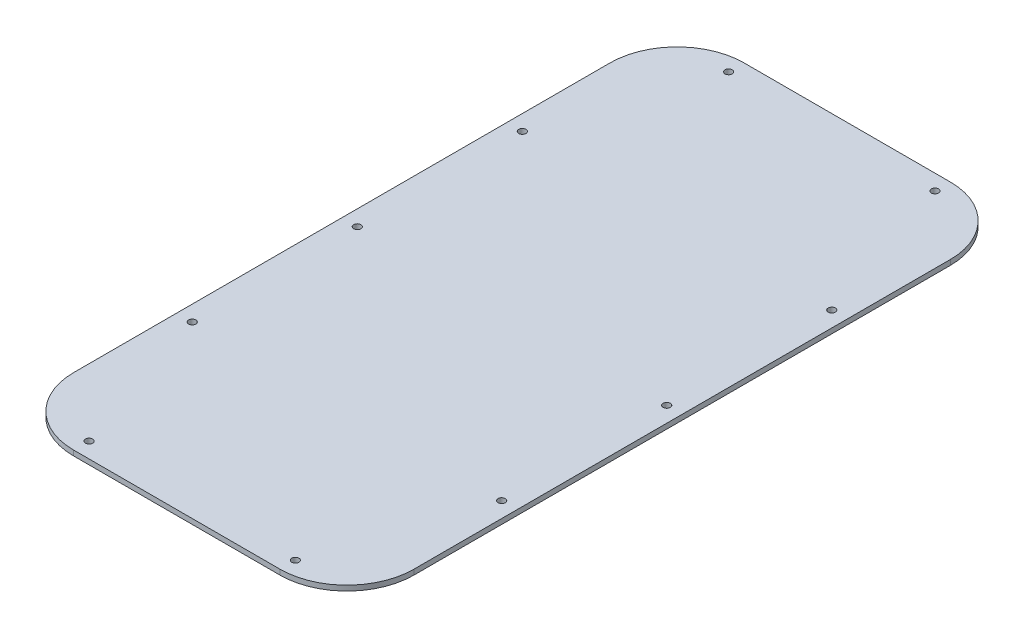
ISO-10303-21;
HEADER;
FILE_DESCRIPTION(('STEP AP214'),'2;1');
FILE_NAME('part.step','',(''),(''),'','','');
FILE_SCHEMA(('AUTOMOTIVE_DESIGN { 1 0 10303 214 1 1 1 1 }'));
ENDSEC;
DATA;
#1=APPLICATION_CONTEXT('core data for automotive mechanical design processes');
#2=APPLICATION_PROTOCOL_DEFINITION('international standard','automotive_design',2000,#1);
#3=PRODUCT_CONTEXT('',#1,'mechanical');
#4=PRODUCT('Part','Part','',(#3));
#5=PRODUCT_RELATED_PRODUCT_CATEGORY('part','',(#4));
#6=PRODUCT_DEFINITION_FORMATION('','',#4);
#7=PRODUCT_DEFINITION_CONTEXT('part definition',#1,'design');
#8=PRODUCT_DEFINITION('design','',#6,#7);
#9=PRODUCT_DEFINITION_SHAPE('','',#8);
#10=(LENGTH_UNIT() NAMED_UNIT(*) SI_UNIT(.MILLI.,.METRE.));
#11=(NAMED_UNIT(*) PLANE_ANGLE_UNIT() SI_UNIT($,.RADIAN.));
#12=(NAMED_UNIT(*) SI_UNIT($,.STERADIAN.) SOLID_ANGLE_UNIT());
#13=UNCERTAINTY_MEASURE_WITH_UNIT(LENGTH_MEASURE(1.E-05),#10,'distance_accuracy_value','');
#14=(GEOMETRIC_REPRESENTATION_CONTEXT(3) GLOBAL_UNCERTAINTY_ASSIGNED_CONTEXT((#13)) GLOBAL_UNIT_ASSIGNED_CONTEXT((#10,
#11,#12)) REPRESENTATION_CONTEXT('',''));
#15=CARTESIAN_POINT('',(0.,0.,0.));
#16=DIRECTION('',(0.,0.,1.));
#17=DIRECTION('',(1.,0.,0.));
#18=AXIS2_PLACEMENT_3D('',#15,#16,#17);
#19=CARTESIAN_POINT('',(-100.,-493.5,1585.));
#20=DIRECTION('',(0.,-1.,0.));
#21=DIRECTION('',(0.,0.,-1.));
#22=AXIS2_PLACEMENT_3D('',#19,#20,#21);
#23=CYLINDRICAL_SURFACE('',#22,65.);
#24=CARTESIAN_POINT('',(-100.,-498.5,1585.));
#25=DIRECTION('',(0.,1.,0.));
#26=DIRECTION('',(0.,0.,1.));
#27=AXIS2_PLACEMENT_3D('',#24,#25,#26);
#28=CIRCLE('',#27,65.);
#29=CARTESIAN_POINT('',(-165.,-498.5,1585.));
#30=VERTEX_POINT('',#29);
#31=CARTESIAN_POINT('',(-99.9999999999997,-498.5,1650.));
#32=VERTEX_POINT('',#31);
#33=EDGE_CURVE('E111',#30,#32,#28,.T.);
#34=ORIENTED_EDGE('',*,*,#33,.T.);
#35=DIRECTION('',(0.,-1.,0.));
#36=VECTOR('',#35,1.);
#37=CARTESIAN_POINT('',(-99.9999999999997,-493.5,1650.));
#38=LINE('',#37,#36);
#39=CARTESIAN_POINT('',(-99.9999999999997,-493.5,1650.));
#40=VERTEX_POINT('',#39);
#41=EDGE_CURVE('E10',#40,#32,#38,.T.);
#42=ORIENTED_EDGE('',*,*,#41,.F.);
#43=CARTESIAN_POINT('',(-100.,-493.5,1585.));
#44=DIRECTION('',(0.,1.,0.));
#45=DIRECTION('',(0.,0.,1.));
#46=AXIS2_PLACEMENT_3D('',#43,#44,#45);
#47=CIRCLE('',#46,65.);
#48=CARTESIAN_POINT('',(-165.,-493.5,1585.));
#49=VERTEX_POINT('',#48);
#50=EDGE_CURVE('E126',#49,#40,#47,.T.);
#51=ORIENTED_EDGE('',*,*,#50,.F.);
#52=DIRECTION('',(0.,-1.,0.));
#53=VECTOR('',#52,1.);
#54=CARTESIAN_POINT('',(-165.,-493.5,1585.));
#55=LINE('',#54,#53);
#56=EDGE_CURVE('E107',#49,#30,#55,.T.);
#57=ORIENTED_EDGE('',*,*,#56,.T.);
#58=EDGE_LOOP('',(#34,#42,#51,#57));
#59=FACE_BOUND('',#58,.T.);
#60=ADVANCED_FACE('F15',(#59),#23,.T.);
#61=CARTESIAN_POINT('',(-99.9999999999997,-493.5,1650.));
#62=DIRECTION('',(0.,0.,-1.));
#63=DIRECTION('',(-1.,0.,0.));
#64=AXIS2_PLACEMENT_3D('',#61,#62,#63);
#65=PLANE('',#64);
#66=DIRECTION('',(1.,0.,0.));
#67=VECTOR('',#66,1.);
#68=CARTESIAN_POINT('',(-99.9999999999997,-498.5,1650.));
#69=LINE('',#68,#67);
#70=CARTESIAN_POINT('',(99.9999999999998,-498.5,1650.));
#71=VERTEX_POINT('',#70);
#72=EDGE_CURVE('E114',#32,#71,#69,.T.);
#73=ORIENTED_EDGE('',*,*,#72,.T.);
#74=DIRECTION('',(0.,-1.,0.));
#75=VECTOR('',#74,1.);
#76=CARTESIAN_POINT('',(99.9999999999998,-493.5,1650.));
#77=LINE('',#76,#75);
#78=CARTESIAN_POINT('',(99.9999999999998,-493.5,1650.));
#79=VERTEX_POINT('',#78);
#80=EDGE_CURVE('E23',#79,#71,#77,.T.);
#81=ORIENTED_EDGE('',*,*,#80,.F.);
#82=DIRECTION('',(1.,0.,0.));
#83=VECTOR('',#82,1.);
#84=CARTESIAN_POINT('',(-99.9999999999997,-493.5,1650.));
#85=LINE('',#84,#83);
#86=EDGE_CURVE('E74',#40,#79,#85,.T.);
#87=ORIENTED_EDGE('',*,*,#86,.F.);
#88=ORIENTED_EDGE('',*,*,#41,.T.);
#89=EDGE_LOOP('',(#73,#81,#87,#88));
#90=FACE_BOUND('',#89,.T.);
#91=ADVANCED_FACE('F256',(#90),#65,.F.);
#92=CARTESIAN_POINT('',(100.,-493.5,1585.));
#93=DIRECTION('',(0.,-1.,0.));
#94=DIRECTION('',(0.,0.,-1.));
#95=AXIS2_PLACEMENT_3D('',#92,#93,#94);
#96=CYLINDRICAL_SURFACE('',#95,65.);
#97=CARTESIAN_POINT('',(100.,-498.5,1585.));
#98=DIRECTION('',(0.,1.,0.));
#99=DIRECTION('',(0.,0.,1.));
#100=AXIS2_PLACEMENT_3D('',#97,#98,#99);
#101=CIRCLE('',#100,65.);
#102=CARTESIAN_POINT('',(165.,-498.5,1585.));
#103=VERTEX_POINT('',#102);
#104=EDGE_CURVE('E117',#71,#103,#101,.T.);
#105=ORIENTED_EDGE('',*,*,#104,.T.);
#106=DIRECTION('',(0.,-1.,0.));
#107=VECTOR('',#106,1.);
#108=CARTESIAN_POINT('',(165.,-493.5,1585.));
#109=LINE('',#108,#107);
#110=CARTESIAN_POINT('',(165.,-493.5,1585.));
#111=VERTEX_POINT('',#110);
#112=EDGE_CURVE('E133',#111,#103,#109,.T.);
#113=ORIENTED_EDGE('',*,*,#112,.F.);
#114=CARTESIAN_POINT('',(100.,-493.5,1585.));
#115=DIRECTION('',(0.,1.,0.));
#116=DIRECTION('',(0.,0.,1.));
#117=AXIS2_PLACEMENT_3D('',#114,#115,#116);
#118=CIRCLE('',#117,65.);
#119=EDGE_CURVE('E141',#79,#111,#118,.T.);
#120=ORIENTED_EDGE('',*,*,#119,.F.);
#121=ORIENTED_EDGE('',*,*,#80,.T.);
#122=EDGE_LOOP('',(#105,#113,#120,#121));
#123=FACE_BOUND('',#122,.T.);
#124=ADVANCED_FACE('F139',(#123),#96,.T.);
#125=CARTESIAN_POINT('',(165.,-493.5,1585.));
#126=DIRECTION('',(-1.,0.,0.));
#127=DIRECTION('',(0.,0.,1.));
#128=AXIS2_PLACEMENT_3D('',#125,#126,#127);
#129=PLANE('',#128);
#130=DIRECTION('',(0.,0.,-1.));
#131=VECTOR('',#130,1.);
#132=CARTESIAN_POINT('',(165.,-498.5,1585.));
#133=LINE('',#132,#131);
#134=CARTESIAN_POINT('',(165.,-498.5,1065.));
#135=VERTEX_POINT('',#134);
#136=EDGE_CURVE('E119',#103,#135,#133,.T.);
#137=ORIENTED_EDGE('',*,*,#136,.T.);
#138=DIRECTION('',(0.,-1.,0.));
#139=VECTOR('',#138,1.);
#140=CARTESIAN_POINT('',(165.,-493.5,1065.));
#141=LINE('',#140,#139);
#142=CARTESIAN_POINT('',(165.,-493.5,1065.));
#143=VERTEX_POINT('',#142);
#144=EDGE_CURVE('E130',#143,#135,#141,.T.);
#145=ORIENTED_EDGE('',*,*,#144,.F.);
#146=DIRECTION('',(0.,0.,-1.));
#147=VECTOR('',#146,1.);
#148=CARTESIAN_POINT('',(165.,-493.5,1585.));
#149=LINE('',#148,#147);
#150=EDGE_CURVE('E153',#111,#143,#149,.T.);
#151=ORIENTED_EDGE('',*,*,#150,.F.);
#152=ORIENTED_EDGE('',*,*,#112,.T.);
#153=EDGE_LOOP('',(#137,#145,#151,#152));
#154=FACE_BOUND('',#153,.T.);
#155=ADVANCED_FACE('F149',(#154),#129,.F.);
#156=CARTESIAN_POINT('',(100.,-493.5,1065.));
#157=DIRECTION('',(0.,-1.,0.));
#158=DIRECTION('',(0.,0.,-1.));
#159=AXIS2_PLACEMENT_3D('',#156,#157,#158);
#160=CYLINDRICAL_SURFACE('',#159,65.);
#161=CARTESIAN_POINT('',(100.,-498.5,1065.));
#162=DIRECTION('',(0.,1.,0.));
#163=DIRECTION('',(0.,0.,1.));
#164=AXIS2_PLACEMENT_3D('',#161,#162,#163);
#165=CIRCLE('',#164,65.);
#166=CARTESIAN_POINT('',(99.9999999999996,-498.5,1000.));
#167=VERTEX_POINT('',#166);
#168=EDGE_CURVE('E121',#135,#167,#165,.T.);
#169=ORIENTED_EDGE('',*,*,#168,.T.);
#170=DIRECTION('',(0.,-1.,0.));
#171=VECTOR('',#170,1.);
#172=CARTESIAN_POINT('',(99.9999999999996,-493.5,1000.));
#173=LINE('',#172,#171);
#174=CARTESIAN_POINT('',(99.9999999999996,-493.5,1000.));
#175=VERTEX_POINT('',#174);
#176=EDGE_CURVE('E102',#175,#167,#173,.T.);
#177=ORIENTED_EDGE('',*,*,#176,.F.);
#178=CARTESIAN_POINT('',(100.,-493.5,1065.));
#179=DIRECTION('',(0.,1.,0.));
#180=DIRECTION('',(0.,0.,1.));
#181=AXIS2_PLACEMENT_3D('',#178,#179,#180);
#182=CIRCLE('',#181,65.);
#183=EDGE_CURVE('E93',#143,#175,#182,.T.);
#184=ORIENTED_EDGE('',*,*,#183,.F.);
#185=ORIENTED_EDGE('',*,*,#144,.T.);
#186=EDGE_LOOP('',(#169,#177,#184,#185));
#187=FACE_BOUND('',#186,.T.);
#188=ADVANCED_FACE('F152',(#187),#160,.T.);
#189=CARTESIAN_POINT('',(99.9999999999996,-493.5,1000.));
#190=DIRECTION('',(0.,0.,1.));
#191=DIRECTION('',(1.,0.,0.));
#192=AXIS2_PLACEMENT_3D('',#189,#190,#191);
#193=PLANE('',#192);
#194=DIRECTION('',(-1.,0.,0.));
#195=VECTOR('',#194,1.);
#196=CARTESIAN_POINT('',(99.9999999999996,-498.5,1000.));
#197=LINE('',#196,#195);
#198=CARTESIAN_POINT('',(-99.9999999999999,-498.5,1000.));
#199=VERTEX_POINT('',#198);
#200=EDGE_CURVE('E101',#167,#199,#197,.T.);
#201=ORIENTED_EDGE('',*,*,#200,.T.);
#202=DIRECTION('',(0.,-1.,0.));
#203=VECTOR('',#202,1.);
#204=CARTESIAN_POINT('',(-99.9999999999999,-493.5,1000.));
#205=LINE('',#204,#203);
#206=CARTESIAN_POINT('',(-99.9999999999999,-493.5,1000.));
#207=VERTEX_POINT('',#206);
#208=EDGE_CURVE('E98',#207,#199,#205,.T.);
#209=ORIENTED_EDGE('',*,*,#208,.F.);
#210=DIRECTION('',(-1.,0.,0.));
#211=VECTOR('',#210,1.);
#212=CARTESIAN_POINT('',(99.9999999999996,-493.5,1000.));
#213=LINE('',#212,#211);
#214=EDGE_CURVE('E87',#175,#207,#213,.T.);
#215=ORIENTED_EDGE('',*,*,#214,.F.);
#216=ORIENTED_EDGE('',*,*,#176,.T.);
#217=EDGE_LOOP('',(#201,#209,#215,#216));
#218=FACE_BOUND('',#217,.T.);
#219=ADVANCED_FACE('F99',(#218),#193,.F.);
#220=CARTESIAN_POINT('',(-100.,-493.5,1065.));
#221=DIRECTION('',(0.,-1.,0.));
#222=DIRECTION('',(0.,0.,-1.));
#223=AXIS2_PLACEMENT_3D('',#220,#221,#222);
#224=CYLINDRICAL_SURFACE('',#223,65.);
#225=CARTESIAN_POINT('',(-100.,-498.5,1065.));
#226=DIRECTION('',(0.,1.,0.));
#227=DIRECTION('',(0.,0.,1.));
#228=AXIS2_PLACEMENT_3D('',#225,#226,#227);
#229=CIRCLE('',#228,65.);
#230=CARTESIAN_POINT('',(-165.,-498.5,1065.));
#231=VERTEX_POINT('',#230);
#232=EDGE_CURVE('E60',#199,#231,#229,.T.);
#233=ORIENTED_EDGE('',*,*,#232,.T.);
#234=DIRECTION('',(0.,-1.,0.));
#235=VECTOR('',#234,1.);
#236=CARTESIAN_POINT('',(-165.,-493.5,1065.));
#237=LINE('',#236,#235);
#238=CARTESIAN_POINT('',(-165.,-493.5,1065.));
#239=VERTEX_POINT('',#238);
#240=EDGE_CURVE('E103',#239,#231,#237,.T.);
#241=ORIENTED_EDGE('',*,*,#240,.F.);
#242=CARTESIAN_POINT('',(-100.,-493.5,1065.));
#243=DIRECTION('',(0.,1.,0.));
#244=DIRECTION('',(0.,0.,1.));
#245=AXIS2_PLACEMENT_3D('',#242,#243,#244);
#246=CIRCLE('',#245,65.);
#247=EDGE_CURVE('E91',#207,#239,#246,.T.);
#248=ORIENTED_EDGE('',*,*,#247,.F.);
#249=ORIENTED_EDGE('',*,*,#208,.T.);
#250=EDGE_LOOP('',(#233,#241,#248,#249));
#251=FACE_BOUND('',#250,.T.);
#252=ADVANCED_FACE('F105',(#251),#224,.T.);
#253=CARTESIAN_POINT('',(-165.,-493.5,1065.));
#254=DIRECTION('',(1.,0.,0.));
#255=DIRECTION('',(0.,0.,-1.));
#256=AXIS2_PLACEMENT_3D('',#253,#254,#255);
#257=PLANE('',#256);
#258=DIRECTION('',(0.,0.,1.));
#259=VECTOR('',#258,1.);
#260=CARTESIAN_POINT('',(-165.,-498.5,1065.));
#261=LINE('',#260,#259);
#262=EDGE_CURVE('E66',#231,#30,#261,.T.);
#263=ORIENTED_EDGE('',*,*,#262,.T.);
#264=ORIENTED_EDGE('',*,*,#56,.F.);
#265=DIRECTION('',(0.,0.,1.));
#266=VECTOR('',#265,1.);
#267=CARTESIAN_POINT('',(-165.,-493.5,1065.));
#268=LINE('',#267,#266);
#269=EDGE_CURVE('E31',#239,#49,#268,.T.);
#270=ORIENTED_EDGE('',*,*,#269,.F.);
#271=ORIENTED_EDGE('',*,*,#240,.T.);
#272=EDGE_LOOP('',(#263,#264,#270,#271));
#273=FACE_BOUND('',#272,.T.);
#274=ADVANCED_FACE('F263',(#273),#257,.F.);
#275=CARTESIAN_POINT('',(-100.,-493.5,1585.));
#276=DIRECTION('',(0.,1.,0.));
#277=DIRECTION('',(0.,0.,1.));
#278=AXIS2_PLACEMENT_3D('',#275,#276,#277);
#279=PLANE('',#278);
#280=CARTESIAN_POINT('',(-150.,-493.5,1165.));
#281=DIRECTION('',(0.,1.,0.));
#282=DIRECTION('',(0.,0.,1.));
#283=AXIS2_PLACEMENT_3D('',#280,#281,#282);
#284=CIRCLE('',#283,3.49999999999992);
#285=CARTESIAN_POINT('',(-150.,-493.5,1168.5));
#286=VERTEX_POINT('',#285);
#287=EDGE_CURVE('E212',#286,#286,#284,.T.);
#288=ORIENTED_EDGE('',*,*,#287,.F.);
#289=EDGE_LOOP('',(#288));
#290=FACE_BOUND('',#289,.T.);
#291=CARTESIAN_POINT('',(-100.,-493.5,1015.));
#292=DIRECTION('',(0.,1.,0.));
#293=DIRECTION('',(0.,0.,1.));
#294=AXIS2_PLACEMENT_3D('',#291,#292,#293);
#295=CIRCLE('',#294,3.49999999999993);
#296=CARTESIAN_POINT('',(-100.,-493.5,1018.5));
#297=VERTEX_POINT('',#296);
#298=EDGE_CURVE('E206',#297,#297,#295,.T.);
#299=ORIENTED_EDGE('',*,*,#298,.F.);
#300=EDGE_LOOP('',(#299));
#301=FACE_BOUND('',#300,.T.);
#302=CARTESIAN_POINT('',(150.,-493.5,1165.));
#303=DIRECTION('',(0.,1.,0.));
#304=DIRECTION('',(0.,0.,1.));
#305=AXIS2_PLACEMENT_3D('',#302,#303,#304);
#306=CIRCLE('',#305,3.49999999999992);
#307=CARTESIAN_POINT('',(150.,-493.5,1168.5));
#308=VERTEX_POINT('',#307);
#309=EDGE_CURVE('E200',#308,#308,#306,.T.);
#310=ORIENTED_EDGE('',*,*,#309,.F.);
#311=EDGE_LOOP('',(#310));
#312=FACE_BOUND('',#311,.T.);
#313=CARTESIAN_POINT('',(100.,-493.5,1015.));
#314=DIRECTION('',(0.,1.,0.));
#315=DIRECTION('',(0.,0.,1.));
#316=AXIS2_PLACEMENT_3D('',#313,#314,#315);
#317=CIRCLE('',#316,3.49999999999993);
#318=CARTESIAN_POINT('',(100.,-493.5,1018.5));
#319=VERTEX_POINT('',#318);
#320=EDGE_CURVE('E194',#319,#319,#317,.T.);
#321=ORIENTED_EDGE('',*,*,#320,.F.);
#322=EDGE_LOOP('',(#321));
#323=FACE_BOUND('',#322,.T.);
#324=CARTESIAN_POINT('',(100.,-493.5,1635.));
#325=DIRECTION('',(0.,1.,0.));
#326=DIRECTION('',(0.,0.,1.));
#327=AXIS2_PLACEMENT_3D('',#324,#325,#326);
#328=CIRCLE('',#327,3.49999999999993);
#329=CARTESIAN_POINT('',(100.,-493.5,1638.5));
#330=VERTEX_POINT('',#329);
#331=EDGE_CURVE('E188',#330,#330,#328,.T.);
#332=ORIENTED_EDGE('',*,*,#331,.F.);
#333=EDGE_LOOP('',(#332));
#334=FACE_BOUND('',#333,.T.);
#335=CARTESIAN_POINT('',(150.,-493.5,1485.));
#336=DIRECTION('',(0.,1.,0.));
#337=DIRECTION('',(0.,0.,1.));
#338=AXIS2_PLACEMENT_3D('',#335,#336,#337);
#339=CIRCLE('',#338,3.49999999999992);
#340=CARTESIAN_POINT('',(150.,-493.5,1488.5));
#341=VERTEX_POINT('',#340);
#342=EDGE_CURVE('E182',#341,#341,#339,.T.);
#343=ORIENTED_EDGE('',*,*,#342,.F.);
#344=EDGE_LOOP('',(#343));
#345=FACE_BOUND('',#344,.T.);
#346=CARTESIAN_POINT('',(-100.,-493.5,1635.));
#347=DIRECTION('',(0.,1.,0.));
#348=DIRECTION('',(0.,0.,1.));
#349=AXIS2_PLACEMENT_3D('',#346,#347,#348);
#350=CIRCLE('',#349,3.49999999999993);
#351=CARTESIAN_POINT('',(-100.,-493.5,1638.5));
#352=VERTEX_POINT('',#351);
#353=EDGE_CURVE('E176',#352,#352,#350,.T.);
#354=ORIENTED_EDGE('',*,*,#353,.F.);
#355=EDGE_LOOP('',(#354));
#356=FACE_BOUND('',#355,.T.);
#357=CARTESIAN_POINT('',(-150.,-493.5,1485.));
#358=DIRECTION('',(0.,1.,0.));
#359=DIRECTION('',(0.,0.,1.));
#360=AXIS2_PLACEMENT_3D('',#357,#358,#359);
#361=CIRCLE('',#360,3.49999999999992);
#362=CARTESIAN_POINT('',(-150.,-493.5,1488.5));
#363=VERTEX_POINT('',#362);
#364=EDGE_CURVE('E170',#363,#363,#361,.T.);
#365=ORIENTED_EDGE('',*,*,#364,.F.);
#366=EDGE_LOOP('',(#365));
#367=FACE_BOUND('',#366,.T.);
#368=CARTESIAN_POINT('',(150.,-493.5,1325.));
#369=DIRECTION('',(0.,1.,0.));
#370=DIRECTION('',(0.,0.,1.));
#371=AXIS2_PLACEMENT_3D('',#368,#369,#370);
#372=CIRCLE('',#371,3.49999999999992);
#373=CARTESIAN_POINT('',(150.,-493.5,1328.5));
#374=VERTEX_POINT('',#373);
#375=EDGE_CURVE('E164',#374,#374,#372,.T.);
#376=ORIENTED_EDGE('',*,*,#375,.F.);
#377=EDGE_LOOP('',(#376));
#378=FACE_BOUND('',#377,.T.);
#379=CARTESIAN_POINT('',(-150.,-493.5,1325.));
#380=DIRECTION('',(0.,1.,0.));
#381=DIRECTION('',(0.,0.,1.));
#382=AXIS2_PLACEMENT_3D('',#379,#380,#381);
#383=CIRCLE('',#382,3.49999999999992);
#384=CARTESIAN_POINT('',(-150.,-493.5,1328.5));
#385=VERTEX_POINT('',#384);
#386=EDGE_CURVE('E115',#385,#385,#383,.T.);
#387=ORIENTED_EDGE('',*,*,#386,.F.);
#388=EDGE_LOOP('',(#387));
#389=FACE_BOUND('',#388,.T.);
#390=ORIENTED_EDGE('',*,*,#50,.T.);
#391=ORIENTED_EDGE('',*,*,#86,.T.);
#392=ORIENTED_EDGE('',*,*,#119,.T.);
#393=ORIENTED_EDGE('',*,*,#150,.T.);
#394=ORIENTED_EDGE('',*,*,#183,.T.);
#395=ORIENTED_EDGE('',*,*,#214,.T.);
#396=ORIENTED_EDGE('',*,*,#247,.T.);
#397=ORIENTED_EDGE('',*,*,#269,.T.);
#398=EDGE_LOOP('',(#390,#391,#392,#393,#394,#395,#396,#397));
#399=FACE_BOUND('',#398,.T.);
#400=ADVANCED_FACE('F89',(#290,#301,#312,#323,#334,#345,#356,#367,#378,#389,#399),#279,.T.);
#401=CARTESIAN_POINT('',(-100.,-498.5,1585.));
#402=DIRECTION('',(0.,1.,0.));
#403=DIRECTION('',(0.,0.,1.));
#404=AXIS2_PLACEMENT_3D('',#401,#402,#403);
#405=PLANE('',#404);
#406=CARTESIAN_POINT('',(-150.,-498.5,1165.));
#407=DIRECTION('',(0.,-1.,0.));
#408=DIRECTION('',(0.,0.,-1.));
#409=AXIS2_PLACEMENT_3D('',#406,#407,#408);
#410=CIRCLE('',#409,3.49999999999998);
#411=CARTESIAN_POINT('',(-150.,-498.5,1161.5));
#412=VERTEX_POINT('',#411);
#413=EDGE_CURVE('E215',#412,#412,#410,.T.);
#414=ORIENTED_EDGE('',*,*,#413,.F.);
#415=EDGE_LOOP('',(#414));
#416=FACE_BOUND('',#415,.T.);
#417=CARTESIAN_POINT('',(-100.,-498.5,1015.));
#418=DIRECTION('',(0.,-1.,0.));
#419=DIRECTION('',(0.,0.,-1.));
#420=AXIS2_PLACEMENT_3D('',#417,#418,#419);
#421=CIRCLE('',#420,3.49999999999999);
#422=CARTESIAN_POINT('',(-100.,-498.5,1011.5));
#423=VERTEX_POINT('',#422);
#424=EDGE_CURVE('E209',#423,#423,#421,.T.);
#425=ORIENTED_EDGE('',*,*,#424,.F.);
#426=EDGE_LOOP('',(#425));
#427=FACE_BOUND('',#426,.T.);
#428=CARTESIAN_POINT('',(150.,-498.5,1165.));
#429=DIRECTION('',(0.,-1.,0.));
#430=DIRECTION('',(0.,0.,-1.));
#431=AXIS2_PLACEMENT_3D('',#428,#429,#430);
#432=CIRCLE('',#431,3.49999999999998);
#433=CARTESIAN_POINT('',(150.,-498.5,1161.5));
#434=VERTEX_POINT('',#433);
#435=EDGE_CURVE('E203',#434,#434,#432,.T.);
#436=ORIENTED_EDGE('',*,*,#435,.F.);
#437=EDGE_LOOP('',(#436));
#438=FACE_BOUND('',#437,.T.);
#439=CARTESIAN_POINT('',(100.,-498.5,1015.));
#440=DIRECTION('',(0.,-1.,0.));
#441=DIRECTION('',(0.,0.,-1.));
#442=AXIS2_PLACEMENT_3D('',#439,#440,#441);
#443=CIRCLE('',#442,3.49999999999999);
#444=CARTESIAN_POINT('',(100.,-498.5,1011.5));
#445=VERTEX_POINT('',#444);
#446=EDGE_CURVE('E197',#445,#445,#443,.T.);
#447=ORIENTED_EDGE('',*,*,#446,.F.);
#448=EDGE_LOOP('',(#447));
#449=FACE_BOUND('',#448,.T.);
#450=CARTESIAN_POINT('',(100.,-498.5,1635.));
#451=DIRECTION('',(0.,-1.,0.));
#452=DIRECTION('',(0.,0.,-1.));
#453=AXIS2_PLACEMENT_3D('',#450,#451,#452);
#454=CIRCLE('',#453,3.49999999999999);
#455=CARTESIAN_POINT('',(100.,-498.5,1631.5));
#456=VERTEX_POINT('',#455);
#457=EDGE_CURVE('E191',#456,#456,#454,.T.);
#458=ORIENTED_EDGE('',*,*,#457,.F.);
#459=EDGE_LOOP('',(#458));
#460=FACE_BOUND('',#459,.T.);
#461=CARTESIAN_POINT('',(150.,-498.5,1485.));
#462=DIRECTION('',(0.,-1.,0.));
#463=DIRECTION('',(0.,0.,-1.));
#464=AXIS2_PLACEMENT_3D('',#461,#462,#463);
#465=CIRCLE('',#464,3.49999999999998);
#466=CARTESIAN_POINT('',(150.,-498.5,1481.5));
#467=VERTEX_POINT('',#466);
#468=EDGE_CURVE('E185',#467,#467,#465,.T.);
#469=ORIENTED_EDGE('',*,*,#468,.F.);
#470=EDGE_LOOP('',(#469));
#471=FACE_BOUND('',#470,.T.);
#472=CARTESIAN_POINT('',(-100.,-498.5,1635.));
#473=DIRECTION('',(0.,-1.,0.));
#474=DIRECTION('',(0.,0.,-1.));
#475=AXIS2_PLACEMENT_3D('',#472,#473,#474);
#476=CIRCLE('',#475,3.49999999999999);
#477=CARTESIAN_POINT('',(-100.,-498.5,1631.5));
#478=VERTEX_POINT('',#477);
#479=EDGE_CURVE('E179',#478,#478,#476,.T.);
#480=ORIENTED_EDGE('',*,*,#479,.F.);
#481=EDGE_LOOP('',(#480));
#482=FACE_BOUND('',#481,.T.);
#483=CARTESIAN_POINT('',(-150.,-498.5,1485.));
#484=DIRECTION('',(0.,-1.,0.));
#485=DIRECTION('',(0.,0.,-1.));
#486=AXIS2_PLACEMENT_3D('',#483,#484,#485);
#487=CIRCLE('',#486,3.49999999999998);
#488=CARTESIAN_POINT('',(-150.,-498.5,1481.5));
#489=VERTEX_POINT('',#488);
#490=EDGE_CURVE('E173',#489,#489,#487,.T.);
#491=ORIENTED_EDGE('',*,*,#490,.F.);
#492=EDGE_LOOP('',(#491));
#493=FACE_BOUND('',#492,.T.);
#494=CARTESIAN_POINT('',(150.,-498.5,1325.));
#495=DIRECTION('',(0.,-1.,0.));
#496=DIRECTION('',(0.,0.,-1.));
#497=AXIS2_PLACEMENT_3D('',#494,#495,#496);
#498=CIRCLE('',#497,3.49999999999998);
#499=CARTESIAN_POINT('',(150.,-498.5,1321.5));
#500=VERTEX_POINT('',#499);
#501=EDGE_CURVE('E167',#500,#500,#498,.T.);
#502=ORIENTED_EDGE('',*,*,#501,.F.);
#503=EDGE_LOOP('',(#502));
#504=FACE_BOUND('',#503,.T.);
#505=CARTESIAN_POINT('',(-150.,-498.5,1325.));
#506=DIRECTION('',(0.,-1.,0.));
#507=DIRECTION('',(0.,0.,-1.));
#508=AXIS2_PLACEMENT_3D('',#505,#506,#507);
#509=CIRCLE('',#508,3.49999999999998);
#510=CARTESIAN_POINT('',(-150.,-498.5,1321.5));
#511=VERTEX_POINT('',#510);
#512=EDGE_CURVE('E161',#511,#511,#509,.T.);
#513=ORIENTED_EDGE('',*,*,#512,.F.);
#514=EDGE_LOOP('',(#513));
#515=FACE_BOUND('',#514,.T.);
#516=ORIENTED_EDGE('',*,*,#33,.F.);
#517=ORIENTED_EDGE('',*,*,#262,.F.);
#518=ORIENTED_EDGE('',*,*,#232,.F.);
#519=ORIENTED_EDGE('',*,*,#200,.F.);
#520=ORIENTED_EDGE('',*,*,#168,.F.);
#521=ORIENTED_EDGE('',*,*,#136,.F.);
#522=ORIENTED_EDGE('',*,*,#104,.F.);
#523=ORIENTED_EDGE('',*,*,#72,.F.);
#524=EDGE_LOOP('',(#516,#517,#518,#519,#520,#521,#522,#523));
#525=FACE_BOUND('',#524,.T.);
#526=ADVANCED_FACE('F145',(#416,#427,#438,#449,#460,#471,#482,#493,#504,#515,#525),#405,.F.);
#527=CARTESIAN_POINT('',(-150.,-498.5,1325.));
#528=DIRECTION('',(0.,-1.,0.));
#529=DIRECTION('',(0.,0.,-1.));
#530=AXIS2_PLACEMENT_3D('',#527,#528,#529);
#531=CYLINDRICAL_SURFACE('',#530,3.49999999999992);
#532=ORIENTED_EDGE('',*,*,#386,.T.);
#533=EDGE_LOOP('',(#532));
#534=FACE_BOUND('',#533,.T.);
#535=ORIENTED_EDGE('',*,*,#512,.T.);
#536=EDGE_LOOP('',(#535));
#537=FACE_BOUND('',#536,.T.);
#538=ADVANCED_FACE('F223',(#534,#537),#531,.F.);
#539=CARTESIAN_POINT('',(150.,-498.5,1325.));
#540=DIRECTION('',(0.,-1.,0.));
#541=DIRECTION('',(0.,0.,-1.));
#542=AXIS2_PLACEMENT_3D('',#539,#540,#541);
#543=CYLINDRICAL_SURFACE('',#542,3.49999999999992);
#544=ORIENTED_EDGE('',*,*,#375,.T.);
#545=EDGE_LOOP('',(#544));
#546=FACE_BOUND('',#545,.T.);
#547=ORIENTED_EDGE('',*,*,#501,.T.);
#548=EDGE_LOOP('',(#547));
#549=FACE_BOUND('',#548,.T.);
#550=ADVANCED_FACE('F244',(#546,#549),#543,.F.);
#551=CARTESIAN_POINT('',(-150.,-498.5,1485.));
#552=DIRECTION('',(0.,-1.,0.));
#553=DIRECTION('',(0.,0.,-1.));
#554=AXIS2_PLACEMENT_3D('',#551,#552,#553);
#555=CYLINDRICAL_SURFACE('',#554,3.49999999999992);
#556=ORIENTED_EDGE('',*,*,#364,.T.);
#557=EDGE_LOOP('',(#556));
#558=FACE_BOUND('',#557,.T.);
#559=ORIENTED_EDGE('',*,*,#490,.T.);
#560=EDGE_LOOP('',(#559));
#561=FACE_BOUND('',#560,.T.);
#562=ADVANCED_FACE('F251',(#558,#561),#555,.F.);
#563=CARTESIAN_POINT('',(-100.,-498.5,1635.));
#564=DIRECTION('',(0.,-1.,0.));
#565=DIRECTION('',(0.,0.,-1.));
#566=AXIS2_PLACEMENT_3D('',#563,#564,#565);
#567=CYLINDRICAL_SURFACE('',#566,3.49999999999993);
#568=ORIENTED_EDGE('',*,*,#353,.T.);
#569=EDGE_LOOP('',(#568));
#570=FACE_BOUND('',#569,.T.);
#571=ORIENTED_EDGE('',*,*,#479,.T.);
#572=EDGE_LOOP('',(#571));
#573=FACE_BOUND('',#572,.T.);
#574=ADVANCED_FACE('F347',(#570,#573),#567,.F.);
#575=CARTESIAN_POINT('',(150.,-498.5,1485.));
#576=DIRECTION('',(0.,-1.,0.));
#577=DIRECTION('',(0.,0.,-1.));
#578=AXIS2_PLACEMENT_3D('',#575,#576,#577);
#579=CYLINDRICAL_SURFACE('',#578,3.49999999999992);
#580=ORIENTED_EDGE('',*,*,#342,.T.);
#581=EDGE_LOOP('',(#580));
#582=FACE_BOUND('',#581,.T.);
#583=ORIENTED_EDGE('',*,*,#468,.T.);
#584=EDGE_LOOP('',(#583));
#585=FACE_BOUND('',#584,.T.);
#586=ADVANCED_FACE('F357',(#582,#585),#579,.F.);
#587=CARTESIAN_POINT('',(100.,-498.5,1635.));
#588=DIRECTION('',(0.,-1.,0.));
#589=DIRECTION('',(0.,0.,-1.));
#590=AXIS2_PLACEMENT_3D('',#587,#588,#589);
#591=CYLINDRICAL_SURFACE('',#590,3.49999999999993);
#592=ORIENTED_EDGE('',*,*,#331,.T.);
#593=EDGE_LOOP('',(#592));
#594=FACE_BOUND('',#593,.T.);
#595=ORIENTED_EDGE('',*,*,#457,.T.);
#596=EDGE_LOOP('',(#595));
#597=FACE_BOUND('',#596,.T.);
#598=ADVANCED_FACE('F367',(#594,#597),#591,.F.);
#599=CARTESIAN_POINT('',(100.,-498.5,1015.));
#600=DIRECTION('',(0.,-1.,0.));
#601=DIRECTION('',(0.,0.,-1.));
#602=AXIS2_PLACEMENT_3D('',#599,#600,#601);
#603=CYLINDRICAL_SURFACE('',#602,3.49999999999993);
#604=ORIENTED_EDGE('',*,*,#320,.T.);
#605=EDGE_LOOP('',(#604));
#606=FACE_BOUND('',#605,.T.);
#607=ORIENTED_EDGE('',*,*,#446,.T.);
#608=EDGE_LOOP('',(#607));
#609=FACE_BOUND('',#608,.T.);
#610=ADVANCED_FACE('F377',(#606,#609),#603,.F.);
#611=CARTESIAN_POINT('',(150.,-498.5,1165.));
#612=DIRECTION('',(0.,-1.,0.));
#613=DIRECTION('',(0.,0.,-1.));
#614=AXIS2_PLACEMENT_3D('',#611,#612,#613);
#615=CYLINDRICAL_SURFACE('',#614,3.49999999999992);
#616=ORIENTED_EDGE('',*,*,#309,.T.);
#617=EDGE_LOOP('',(#616));
#618=FACE_BOUND('',#617,.T.);
#619=ORIENTED_EDGE('',*,*,#435,.T.);
#620=EDGE_LOOP('',(#619));
#621=FACE_BOUND('',#620,.T.);
#622=ADVANCED_FACE('F387',(#618,#621),#615,.F.);
#623=CARTESIAN_POINT('',(-100.,-498.5,1015.));
#624=DIRECTION('',(0.,-1.,0.));
#625=DIRECTION('',(0.,0.,-1.));
#626=AXIS2_PLACEMENT_3D('',#623,#624,#625);
#627=CYLINDRICAL_SURFACE('',#626,3.49999999999993);
#628=ORIENTED_EDGE('',*,*,#298,.T.);
#629=EDGE_LOOP('',(#628));
#630=FACE_BOUND('',#629,.T.);
#631=ORIENTED_EDGE('',*,*,#424,.T.);
#632=EDGE_LOOP('',(#631));
#633=FACE_BOUND('',#632,.T.);
#634=ADVANCED_FACE('F397',(#630,#633),#627,.F.);
#635=CARTESIAN_POINT('',(-150.,-498.5,1165.));
#636=DIRECTION('',(0.,-1.,0.));
#637=DIRECTION('',(0.,0.,-1.));
#638=AXIS2_PLACEMENT_3D('',#635,#636,#637);
#639=CYLINDRICAL_SURFACE('',#638,3.49999999999992);
#640=ORIENTED_EDGE('',*,*,#287,.T.);
#641=EDGE_LOOP('',(#640));
#642=FACE_BOUND('',#641,.T.);
#643=ORIENTED_EDGE('',*,*,#413,.T.);
#644=EDGE_LOOP('',(#643));
#645=FACE_BOUND('',#644,.T.);
#646=ADVANCED_FACE('F219',(#642,#645),#639,.F.);
#647=CLOSED_SHELL('',(#60,#91,#124,#155,#188,#219,#252,#274,#400,#526,#538,#550,#562,#574,#586,
#598,#610,#622,#634,#646));
#648=MANIFOLD_SOLID_BREP('B1',#647);
#649=ADVANCED_BREP_SHAPE_REPRESENTATION('',(#18,#648),#14);
#650=SHAPE_DEFINITION_REPRESENTATION(#9,#649);
ENDSEC;
END-ISO-10303-21;
